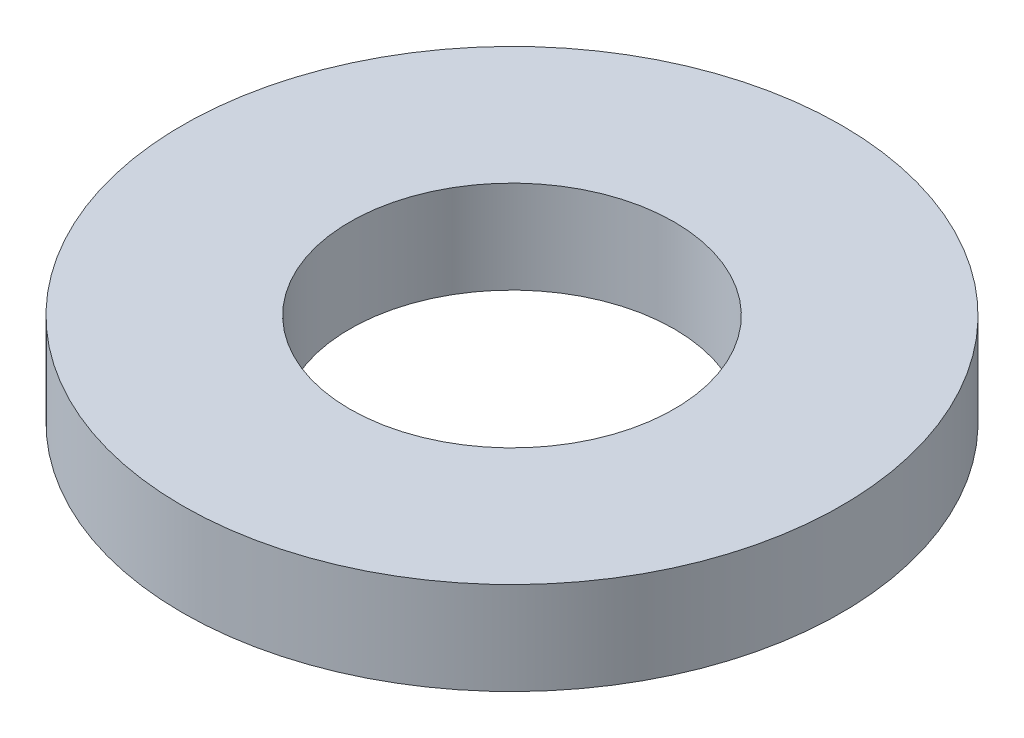
ISO-10303-21;
HEADER;
FILE_DESCRIPTION(('STEP AP214'),'2;1');
FILE_NAME('part.step','',(''),(''),'','','');
FILE_SCHEMA(('AUTOMOTIVE_DESIGN { 1 0 10303 214 1 1 1 1 }'));
ENDSEC;
DATA;
#1=APPLICATION_CONTEXT('core data for automotive mechanical design processes');
#2=APPLICATION_PROTOCOL_DEFINITION('international standard','automotive_design',2000,#1);
#3=PRODUCT_CONTEXT('',#1,'mechanical');
#4=PRODUCT('Part','Part','',(#3));
#5=PRODUCT_RELATED_PRODUCT_CATEGORY('part','',(#4));
#6=PRODUCT_DEFINITION_FORMATION('','',#4);
#7=PRODUCT_DEFINITION_CONTEXT('part definition',#1,'design');
#8=PRODUCT_DEFINITION('design','',#6,#7);
#9=PRODUCT_DEFINITION_SHAPE('','',#8);
#10=(LENGTH_UNIT() NAMED_UNIT(*) SI_UNIT(.MILLI.,.METRE.));
#11=(NAMED_UNIT(*) PLANE_ANGLE_UNIT() SI_UNIT($,.RADIAN.));
#12=(NAMED_UNIT(*) SI_UNIT($,.STERADIAN.) SOLID_ANGLE_UNIT());
#13=UNCERTAINTY_MEASURE_WITH_UNIT(LENGTH_MEASURE(1.E-05),#10,'distance_accuracy_value','');
#14=(GEOMETRIC_REPRESENTATION_CONTEXT(3) GLOBAL_UNCERTAINTY_ASSIGNED_CONTEXT((#13)) GLOBAL_UNIT_ASSIGNED_CONTEXT((#10,
#11,#12)) REPRESENTATION_CONTEXT('',''));
#15=CARTESIAN_POINT('',(0.,0.,0.));
#16=DIRECTION('',(0.,0.,1.));
#17=DIRECTION('',(1.,0.,0.));
#18=AXIS2_PLACEMENT_3D('',#15,#16,#17);
#19=CARTESIAN_POINT('',(0.,8.,0.));
#20=DIRECTION('',(0.,-1.,0.));
#21=DIRECTION('',(0.,0.,-1.));
#22=AXIS2_PLACEMENT_3D('',#19,#20,#21);
#23=CYLINDRICAL_SURFACE('',#22,28.45);
#24=CARTESIAN_POINT('',(0.,8.,0.));
#25=DIRECTION('',(0.,1.,0.));
#26=DIRECTION('',(0.,0.,1.));
#27=AXIS2_PLACEMENT_3D('',#24,#25,#26);
#28=CIRCLE('',#27,28.45);
#29=CARTESIAN_POINT('',(0.,8.,28.45));
#30=VERTEX_POINT('',#29);
#31=EDGE_CURVE('E10',#30,#30,#28,.T.);
#32=ORIENTED_EDGE('',*,*,#31,.F.);
#33=EDGE_LOOP('',(#32));
#34=FACE_BOUND('',#33,.T.);
#35=CARTESIAN_POINT('',(0.,0.,0.));
#36=DIRECTION('',(0.,1.,0.));
#37=DIRECTION('',(0.,0.,1.));
#38=AXIS2_PLACEMENT_3D('',#35,#36,#37);
#39=CIRCLE('',#38,28.45);
#40=CARTESIAN_POINT('',(0.,0.,28.45));
#41=VERTEX_POINT('',#40);
#42=EDGE_CURVE('E42',#41,#41,#39,.T.);
#43=ORIENTED_EDGE('',*,*,#42,.T.);
#44=EDGE_LOOP('',(#43));
#45=FACE_BOUND('',#44,.T.);
#46=ADVANCED_FACE('F39',(#34,#45),#23,.T.);
#47=CARTESIAN_POINT('',(0.,8.,0.));
#48=DIRECTION('',(0.,1.,0.));
#49=DIRECTION('',(0.,0.,1.));
#50=AXIS2_PLACEMENT_3D('',#47,#48,#49);
#51=PLANE('',#50);
#52=CARTESIAN_POINT('',(0.,8.,0.));
#53=DIRECTION('',(0.,1.,0.));
#54=DIRECTION('',(0.,0.,1.));
#55=AXIS2_PLACEMENT_3D('',#52,#53,#54);
#56=CIRCLE('',#55,14.);
#57=CARTESIAN_POINT('',(0.,8.,14.));
#58=VERTEX_POINT('',#57);
#59=EDGE_CURVE('E51',#58,#58,#56,.T.);
#60=ORIENTED_EDGE('',*,*,#59,.F.);
#61=EDGE_LOOP('',(#60));
#62=FACE_BOUND('',#61,.T.);
#63=ORIENTED_EDGE('',*,*,#31,.T.);
#64=EDGE_LOOP('',(#63));
#65=FACE_BOUND('',#64,.T.);
#66=ADVANCED_FACE('F66',(#62,#65),#51,.T.);
#67=CARTESIAN_POINT('',(0.,0.,0.));
#68=DIRECTION('',(0.,1.,0.));
#69=DIRECTION('',(0.,0.,1.));
#70=AXIS2_PLACEMENT_3D('',#67,#68,#69);
#71=PLANE('',#70);
#72=CARTESIAN_POINT('',(0.,0.,0.));
#73=DIRECTION('',(0.,1.,0.));
#74=DIRECTION('',(0.,0.,1.));
#75=AXIS2_PLACEMENT_3D('',#72,#73,#74);
#76=CIRCLE('',#75,14.);
#77=CARTESIAN_POINT('',(0.,0.,14.));
#78=VERTEX_POINT('',#77);
#79=EDGE_CURVE('E49',#78,#78,#76,.T.);
#80=ORIENTED_EDGE('',*,*,#79,.T.);
#81=EDGE_LOOP('',(#80));
#82=FACE_BOUND('',#81,.T.);
#83=ORIENTED_EDGE('',*,*,#42,.F.);
#84=EDGE_LOOP('',(#83));
#85=FACE_BOUND('',#84,.T.);
#86=ADVANCED_FACE('F57',(#82,#85),#71,.F.);
#87=CARTESIAN_POINT('',(0.,0.,0.));
#88=DIRECTION('',(0.,1.,0.));
#89=DIRECTION('',(0.,0.,1.));
#90=AXIS2_PLACEMENT_3D('',#87,#88,#89);
#91=CYLINDRICAL_SURFACE('',#90,14.);
#92=ORIENTED_EDGE('',*,*,#79,.F.);
#93=EDGE_LOOP('',(#92));
#94=FACE_BOUND('',#93,.T.);
#95=ORIENTED_EDGE('',*,*,#59,.T.);
#96=EDGE_LOOP('',(#95));
#97=FACE_BOUND('',#96,.T.);
#98=ADVANCED_FACE('F60',(#94,#97),#91,.F.);
#99=CLOSED_SHELL('',(#46,#66,#86,#98));
#100=MANIFOLD_SOLID_BREP('B2',#99);
#101=ADVANCED_BREP_SHAPE_REPRESENTATION('',(#18,#100),#14);
#102=SHAPE_DEFINITION_REPRESENTATION(#9,#101);
ENDSEC;
END-ISO-10303-21;
